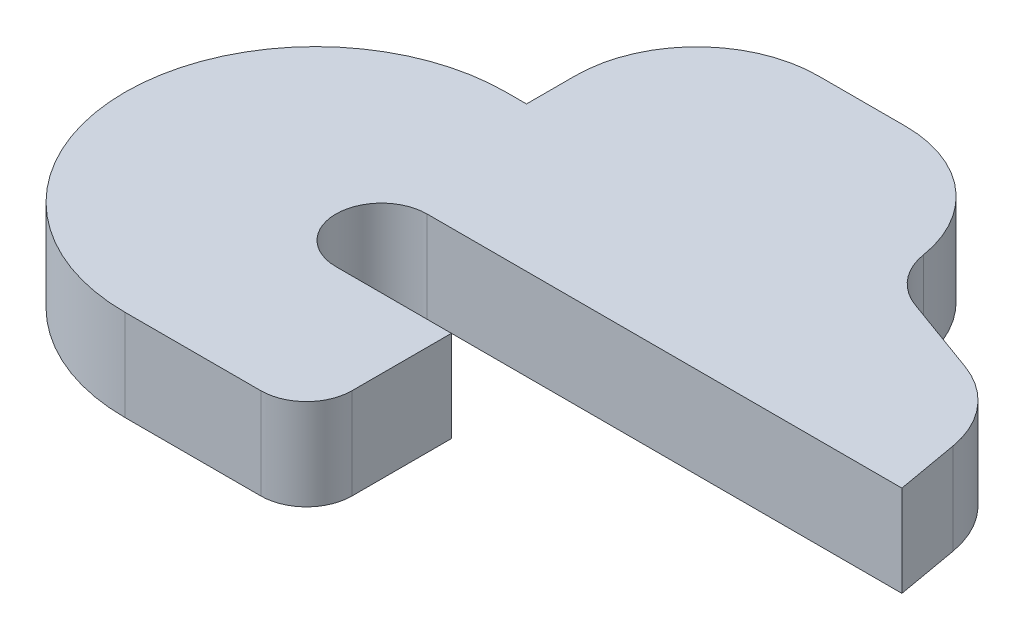
ISO-10303-21;
HEADER;
FILE_DESCRIPTION(('STEP AP214'),'2;1');
FILE_NAME('part.step','',(''),(''),'','','');
FILE_SCHEMA(('AUTOMOTIVE_DESIGN { 1 0 10303 214 1 1 1 1 }'));
ENDSEC;
DATA;
#1=APPLICATION_CONTEXT('core data for automotive mechanical design processes');
#2=APPLICATION_PROTOCOL_DEFINITION('international standard','automotive_design',2000,#1);
#3=PRODUCT_CONTEXT('',#1,'mechanical');
#4=PRODUCT('Part','Part','',(#3));
#5=PRODUCT_RELATED_PRODUCT_CATEGORY('part','',(#4));
#6=PRODUCT_DEFINITION_FORMATION('','',#4);
#7=PRODUCT_DEFINITION_CONTEXT('part definition',#1,'design');
#8=PRODUCT_DEFINITION('design','',#6,#7);
#9=PRODUCT_DEFINITION_SHAPE('','',#8);
#10=(LENGTH_UNIT() NAMED_UNIT(*) SI_UNIT(.MILLI.,.METRE.));
#11=(NAMED_UNIT(*) PLANE_ANGLE_UNIT() SI_UNIT($,.RADIAN.));
#12=(NAMED_UNIT(*) SI_UNIT($,.STERADIAN.) SOLID_ANGLE_UNIT());
#13=UNCERTAINTY_MEASURE_WITH_UNIT(LENGTH_MEASURE(1.E-05),#10,'distance_accuracy_value','');
#14=(GEOMETRIC_REPRESENTATION_CONTEXT(3) GLOBAL_UNCERTAINTY_ASSIGNED_CONTEXT((#13)) GLOBAL_UNIT_ASSIGNED_CONTEXT((#10,
#11,#12)) REPRESENTATION_CONTEXT('',''));
#15=CARTESIAN_POINT('',(0.,0.,0.));
#16=DIRECTION('',(0.,0.,1.));
#17=DIRECTION('',(1.,0.,0.));
#18=AXIS2_PLACEMENT_3D('',#15,#16,#17);
#19=CARTESIAN_POINT('',(0.,3.,3.27));
#20=DIRECTION('',(-1.,0.,0.));
#21=DIRECTION('',(0.,0.,1.));
#22=AXIS2_PLACEMENT_3D('',#19,#20,#21);
#23=PLANE('',#22);
#24=DIRECTION('',(0.,0.,-1.));
#25=VECTOR('',#24,1.);
#26=CARTESIAN_POINT('',(0.,0.,3.27));
#27=LINE('',#26,#25);
#28=CARTESIAN_POINT('',(0.,0.,3.27));
#29=VERTEX_POINT('',#28);
#30=CARTESIAN_POINT('',(0.,0.,0.));
#31=VERTEX_POINT('',#30);
#32=EDGE_CURVE('E177',#29,#31,#27,.T.);
#33=ORIENTED_EDGE('',*,*,#32,.T.);
#34=DIRECTION('',(0.,-1.,0.));
#35=VECTOR('',#34,1.);
#36=CARTESIAN_POINT('',(0.,3.,0.));
#37=LINE('',#36,#35);
#38=CARTESIAN_POINT('',(0.,3.,0.));
#39=VERTEX_POINT('',#38);
#40=EDGE_CURVE('E11',#39,#31,#37,.T.);
#41=ORIENTED_EDGE('',*,*,#40,.F.);
#42=DIRECTION('',(0.,0.,-1.));
#43=VECTOR('',#42,1.);
#44=CARTESIAN_POINT('',(0.,3.,3.27));
#45=LINE('',#44,#43);
#46=CARTESIAN_POINT('',(0.,3.,3.27));
#47=VERTEX_POINT('',#46);
#48=EDGE_CURVE('E207',#47,#39,#45,.T.);
#49=ORIENTED_EDGE('',*,*,#48,.F.);
#50=DIRECTION('',(0.,-1.,0.));
#51=VECTOR('',#50,1.);
#52=CARTESIAN_POINT('',(0.,3.,3.27));
#53=LINE('',#52,#51);
#54=EDGE_CURVE('E173',#47,#29,#53,.T.);
#55=ORIENTED_EDGE('',*,*,#54,.T.);
#56=EDGE_LOOP('',(#33,#41,#49,#55));
#57=FACE_BOUND('',#56,.T.);
#58=ADVANCED_FACE('F33',(#57),#23,.F.);
#59=CARTESIAN_POINT('',(0.,3.,0.));
#60=DIRECTION('',(0.,0.,1.));
#61=DIRECTION('',(1.,0.,0.));
#62=AXIS2_PLACEMENT_3D('',#59,#60,#61);
#63=PLANE('',#62);
#64=DIRECTION('',(-1.,0.,0.));
#65=VECTOR('',#64,1.);
#66=CARTESIAN_POINT('',(0.,0.,0.));
#67=LINE('',#66,#65);
#68=CARTESIAN_POINT('',(-3.8,0.,0.));
#69=VERTEX_POINT('',#68);
#70=EDGE_CURVE('E180',#31,#69,#67,.T.);
#71=ORIENTED_EDGE('',*,*,#70,.T.);
#72=DIRECTION('',(0.,-1.,0.));
#73=VECTOR('',#72,1.);
#74=CARTESIAN_POINT('',(-3.8,3.,0.));
#75=LINE('',#74,#73);
#76=CARTESIAN_POINT('',(-3.8,3.,0.));
#77=VERTEX_POINT('',#76);
#78=EDGE_CURVE('E41',#77,#69,#75,.T.);
#79=ORIENTED_EDGE('',*,*,#78,.F.);
#80=DIRECTION('',(-1.,0.,0.));
#81=VECTOR('',#80,1.);
#82=CARTESIAN_POINT('',(0.,3.,0.));
#83=LINE('',#82,#81);
#84=EDGE_CURVE('E116',#39,#77,#83,.T.);
#85=ORIENTED_EDGE('',*,*,#84,.F.);
#86=ORIENTED_EDGE('',*,*,#40,.T.);
#87=EDGE_LOOP('',(#71,#79,#85,#86));
#88=FACE_BOUND('',#87,.T.);
#89=ADVANCED_FACE('F305',(#88),#63,.F.);
#90=CARTESIAN_POINT('',(-3.8,3.,-1.5));
#91=DIRECTION('',(0.,-1.,0.));
#92=DIRECTION('',(0.,0.,-1.));
#93=AXIS2_PLACEMENT_3D('',#90,#91,#92);
#94=CYLINDRICAL_SURFACE('',#93,1.5);
#95=CARTESIAN_POINT('',(-3.8,0.,-1.5));
#96=DIRECTION('',(0.,-1.,0.));
#97=DIRECTION('',(0.,0.,-1.));
#98=AXIS2_PLACEMENT_3D('',#95,#96,#97);
#99=CIRCLE('',#98,1.5);
#100=CARTESIAN_POINT('',(-3.8,0.,-3.));
#101=VERTEX_POINT('',#100);
#102=EDGE_CURVE('E182',#69,#101,#99,.T.);
#103=ORIENTED_EDGE('',*,*,#102,.T.);
#104=DIRECTION('',(0.,-1.,0.));
#105=VECTOR('',#104,1.);
#106=CARTESIAN_POINT('',(-3.8,3.,-3.));
#107=LINE('',#106,#105);
#108=CARTESIAN_POINT('',(-3.8,3.,-3.));
#109=VERTEX_POINT('',#108);
#110=EDGE_CURVE('E238',#109,#101,#107,.T.);
#111=ORIENTED_EDGE('',*,*,#110,.F.);
#112=CARTESIAN_POINT('',(-3.8,3.,-1.5));
#113=DIRECTION('',(0.,-1.,0.));
#114=DIRECTION('',(0.,0.,-1.));
#115=AXIS2_PLACEMENT_3D('',#112,#113,#114);
#116=CIRCLE('',#115,1.5);
#117=EDGE_CURVE('E246',#77,#109,#116,.T.);
#118=ORIENTED_EDGE('',*,*,#117,.F.);
#119=ORIENTED_EDGE('',*,*,#78,.T.);
#120=EDGE_LOOP('',(#103,#111,#118,#119));
#121=FACE_BOUND('',#120,.T.);
#122=ADVANCED_FACE('F244',(#121),#94,.F.);
#123=CARTESIAN_POINT('',(-3.8,3.,-3.));
#124=DIRECTION('',(0.,0.,-1.));
#125=DIRECTION('',(-1.,0.,0.));
#126=AXIS2_PLACEMENT_3D('',#123,#124,#125);
#127=PLANE('',#126);
#128=DIRECTION('',(1.,0.,0.));
#129=VECTOR('',#128,1.);
#130=CARTESIAN_POINT('',(-3.8,0.,-3.));
#131=LINE('',#130,#129);
#132=CARTESIAN_POINT('',(11.82,0.,-3.));
#133=VERTEX_POINT('',#132);
#134=EDGE_CURVE('E184',#101,#133,#131,.T.);
#135=ORIENTED_EDGE('',*,*,#134,.T.);
#136=DIRECTION('',(0.,-1.,0.));
#137=VECTOR('',#136,1.);
#138=CARTESIAN_POINT('',(11.82,3.,-3.));
#139=LINE('',#138,#137);
#140=CARTESIAN_POINT('',(11.82,3.,-3.));
#141=VERTEX_POINT('',#140);
#142=EDGE_CURVE('E235',#141,#133,#139,.T.);
#143=ORIENTED_EDGE('',*,*,#142,.F.);
#144=DIRECTION('',(1.,0.,0.));
#145=VECTOR('',#144,1.);
#146=CARTESIAN_POINT('',(-3.8,3.,-3.));
#147=LINE('',#146,#145);
#148=EDGE_CURVE('E264',#109,#141,#147,.T.);
#149=ORIENTED_EDGE('',*,*,#148,.F.);
#150=ORIENTED_EDGE('',*,*,#110,.T.);
#151=EDGE_LOOP('',(#135,#143,#149,#150));
#152=FACE_BOUND('',#151,.T.);
#153=ADVANCED_FACE('F255',(#152),#127,.F.);
#154=CARTESIAN_POINT('',(11.82,3.,-3.));
#155=DIRECTION('',(-0.984807753012207,0.,0.173648177666935));
#156=DIRECTION('',(0.173648177666935,0.,0.984807753012207));
#157=AXIS2_PLACEMENT_3D('',#154,#155,#156);
#158=PLANE('',#157);
#159=DIRECTION('',(-0.173648177666935,0.,-0.984807753012207));
#160=VECTOR('',#159,1.);
#161=CARTESIAN_POINT('',(11.82,0.,-3.));
#162=LINE('',#161,#160);
#163=CARTESIAN_POINT('',(11.4588221154867,0.,-5.04834157008812));
#164=VERTEX_POINT('',#163);
#165=EDGE_CURVE('E186',#133,#164,#162,.T.);
#166=ORIENTED_EDGE('',*,*,#165,.T.);
#167=DIRECTION('',(0.,-1.,0.));
#168=VECTOR('',#167,1.);
#169=CARTESIAN_POINT('',(11.4588221154867,3.,-5.04834157008812));
#170=LINE('',#169,#168);
#171=CARTESIAN_POINT('',(11.4588221154867,3.,-5.04834157008812));
#172=VERTEX_POINT('',#171);
#173=EDGE_CURVE('E232',#172,#164,#170,.T.);
#174=ORIENTED_EDGE('',*,*,#173,.F.);
#175=DIRECTION('',(-0.173648177666935,0.,-0.984807753012207));
#176=VECTOR('',#175,1.);
#177=CARTESIAN_POINT('',(11.82,3.,-3.));
#178=LINE('',#177,#176);
#179=EDGE_CURVE('E261',#141,#172,#178,.T.);
#180=ORIENTED_EDGE('',*,*,#179,.F.);
#181=ORIENTED_EDGE('',*,*,#142,.T.);
#182=EDGE_LOOP('',(#166,#174,#180,#181));
#183=FACE_BOUND('',#182,.T.);
#184=ADVANCED_FACE('F259',(#183),#158,.F.);
#185=CARTESIAN_POINT('',(8.30743730584765,3.,-4.49266740155393));
#186=DIRECTION('',(0.,-1.,0.));
#187=DIRECTION('',(0.,0.,-1.));
#188=AXIS2_PLACEMENT_3D('',#185,#186,#187);
#189=CYLINDRICAL_SURFACE('',#188,3.2);
#190=CARTESIAN_POINT('',(8.30743730584765,0.,-4.49266740155393));
#191=DIRECTION('',(0.,1.,0.));
#192=DIRECTION('',(0.,0.,1.));
#193=AXIS2_PLACEMENT_3D('',#190,#191,#192);
#194=CIRCLE('',#193,3.2);
#195=CARTESIAN_POINT('',(9.40103258853848,0.,-7.5));
#196=VERTEX_POINT('',#195);
#197=EDGE_CURVE('E188',#164,#196,#194,.T.);
#198=ORIENTED_EDGE('',*,*,#197,.T.);
#199=DIRECTION('',(0.,-1.,0.));
#200=VECTOR('',#199,1.);
#201=CARTESIAN_POINT('',(9.40103258853848,3.,-7.5));
#202=LINE('',#201,#200);
#203=CARTESIAN_POINT('',(9.40103258853848,3.,-7.5));
#204=VERTEX_POINT('',#203);
#205=EDGE_CURVE('E229',#204,#196,#202,.T.);
#206=ORIENTED_EDGE('',*,*,#205,.F.);
#207=CARTESIAN_POINT('',(8.30743730584765,3.,-4.49266740155393));
#208=DIRECTION('',(0.,1.,0.));
#209=DIRECTION('',(0.,0.,1.));
#210=AXIS2_PLACEMENT_3D('',#207,#208,#209);
#211=CIRCLE('',#210,3.2);
#212=EDGE_CURVE('E263',#172,#204,#211,.T.);
#213=ORIENTED_EDGE('',*,*,#212,.F.);
#214=ORIENTED_EDGE('',*,*,#173,.T.);
#215=EDGE_LOOP('',(#198,#206,#213,#214));
#216=FACE_BOUND('',#215,.T.);
#217=ADVANCED_FACE('F318',(#216),#189,.T.);
#218=CARTESIAN_POINT('',(6.82,3.,-8.43857429163487));
#219=DIRECTION('',(-0.341748525840883,0.,0.939791437014396));
#220=DIRECTION('',(0.939791437014396,0.,0.341748525840883));
#221=AXIS2_PLACEMENT_3D('',#218,#219,#220);
#222=PLANE('',#221);
#223=DIRECTION('',(-0.939791437014396,0.,-0.341748525840883));
#224=VECTOR('',#223,1.);
#225=CARTESIAN_POINT('',(6.82,0.,-8.43857429163487));
#226=LINE('',#225,#224);
#227=CARTESIAN_POINT('',(6.82,0.,-8.43857429163487));
#228=VERTEX_POINT('',#227);
#229=EDGE_CURVE('E190',#196,#228,#226,.T.);
#230=ORIENTED_EDGE('',*,*,#229,.T.);
#231=DIRECTION('',(0.,-1.,0.));
#232=VECTOR('',#231,1.);
#233=CARTESIAN_POINT('',(6.82,3.,-8.43857429163487));
#234=LINE('',#233,#232);
#235=CARTESIAN_POINT('',(6.82,3.,-8.43857429163487));
#236=VERTEX_POINT('',#235);
#237=EDGE_CURVE('E226',#236,#228,#234,.T.);
#238=ORIENTED_EDGE('',*,*,#237,.F.);
#239=DIRECTION('',(-0.939791437014396,0.,-0.341748525840883));
#240=VECTOR('',#239,1.);
#241=CARTESIAN_POINT('',(6.82,3.,-8.43857429163487));
#242=LINE('',#241,#240);
#243=EDGE_CURVE('E266',#204,#236,#242,.T.);
#244=ORIENTED_EDGE('',*,*,#243,.F.);
#245=ORIENTED_EDGE('',*,*,#205,.T.);
#246=EDGE_LOOP('',(#230,#238,#244,#245));
#247=FACE_BOUND('',#246,.T.);
#248=ADVANCED_FACE('F321',(#247),#222,.F.);
#249=CARTESIAN_POINT('',(7.50349705168176,3.,-10.3181571656637));
#250=DIRECTION('',(0.,-1.,0.));
#251=DIRECTION('',(0.,0.,-1.));
#252=AXIS2_PLACEMENT_3D('',#249,#250,#251);
#253=CYLINDRICAL_SURFACE('',#252,2.);
#254=CARTESIAN_POINT('',(7.50349705168176,0.,-10.3181571656637));
#255=DIRECTION('',(0.,-1.,0.));
#256=DIRECTION('',(0.,0.,-1.));
#257=AXIS2_PLACEMENT_3D('',#254,#255,#256);
#258=CIRCLE('',#257,2.);
#259=CARTESIAN_POINT('',(5.52862721098619,0.,-10.0021047771091));
#260=VERTEX_POINT('',#259);
#261=EDGE_CURVE('E192',#228,#260,#258,.T.);
#262=ORIENTED_EDGE('',*,*,#261,.T.);
#263=DIRECTION('',(0.,-1.,0.));
#264=VECTOR('',#263,1.);
#265=CARTESIAN_POINT('',(5.52862721098619,3.,-10.0021047771091));
#266=LINE('',#265,#264);
#267=CARTESIAN_POINT('',(5.52862721098619,3.,-10.0021047771091));
#268=VERTEX_POINT('',#267);
#269=EDGE_CURVE('E223',#268,#260,#266,.T.);
#270=ORIENTED_EDGE('',*,*,#269,.F.);
#271=CARTESIAN_POINT('',(7.50349705168176,3.,-10.3181571656637));
#272=DIRECTION('',(0.,-1.,0.));
#273=DIRECTION('',(0.,0.,-1.));
#274=AXIS2_PLACEMENT_3D('',#271,#272,#273);
#275=CIRCLE('',#274,2.);
#276=EDGE_CURVE('E272',#236,#268,#275,.T.);
#277=ORIENTED_EDGE('',*,*,#276,.F.);
#278=ORIENTED_EDGE('',*,*,#237,.T.);
#279=EDGE_LOOP('',(#262,#270,#277,#278));
#280=FACE_BOUND('',#279,.T.);
#281=ADVANCED_FACE('F325',(#280),#253,.F.);
#282=CARTESIAN_POINT('',(1.57888752959504,3.,-9.37));
#283=DIRECTION('',(0.,-1.,0.));
#284=DIRECTION('',(0.,0.,-1.));
#285=AXIS2_PLACEMENT_3D('',#282,#283,#284);
#286=CYLINDRICAL_SURFACE('',#285,4.);
#287=CARTESIAN_POINT('',(1.57888752959504,0.,-9.37));
#288=DIRECTION('',(0.,1.,0.));
#289=DIRECTION('',(0.,0.,-1.));
#290=AXIS2_PLACEMENT_3D('',#287,#288,#289);
#291=CIRCLE('',#290,4.);
#292=CARTESIAN_POINT('',(1.57888752959504,0.,-13.37));
#293=VERTEX_POINT('',#292);
#294=EDGE_CURVE('E194',#260,#293,#291,.T.);
#295=ORIENTED_EDGE('',*,*,#294,.T.);
#296=DIRECTION('',(0.,-1.,0.));
#297=VECTOR('',#296,1.);
#298=CARTESIAN_POINT('',(1.57888752959504,3.,-13.37));
#299=LINE('',#298,#297);
#300=CARTESIAN_POINT('',(1.57888752959504,3.,-13.37));
#301=VERTEX_POINT('',#300);
#302=EDGE_CURVE('E220',#301,#293,#299,.T.);
#303=ORIENTED_EDGE('',*,*,#302,.F.);
#304=CARTESIAN_POINT('',(1.57888752959504,3.,-9.37));
#305=DIRECTION('',(0.,1.,0.));
#306=DIRECTION('',(0.,0.,-1.));
#307=AXIS2_PLACEMENT_3D('',#304,#305,#306);
#308=CIRCLE('',#307,4.);
#309=EDGE_CURVE('E274',#268,#301,#308,.T.);
#310=ORIENTED_EDGE('',*,*,#309,.F.);
#311=ORIENTED_EDGE('',*,*,#269,.T.);
#312=EDGE_LOOP('',(#295,#303,#310,#311));
#313=FACE_BOUND('',#312,.T.);
#314=ADVANCED_FACE('F329',(#313),#286,.T.);
#315=CARTESIAN_POINT('',(1.57888752959504,3.,-13.37));
#316=DIRECTION('',(0.,0.,1.));
#317=DIRECTION('',(1.,0.,0.));
#318=AXIS2_PLACEMENT_3D('',#315,#316,#317);
#319=PLANE('',#318);
#320=DIRECTION('',(-1.,0.,0.));
#321=VECTOR('',#320,1.);
#322=CARTESIAN_POINT('',(1.57888752959504,0.,-13.37));
#323=LINE('',#322,#321);
#324=CARTESIAN_POINT('',(-1.3,0.,-13.37));
#325=VERTEX_POINT('',#324);
#326=EDGE_CURVE('E196',#293,#325,#323,.T.);
#327=ORIENTED_EDGE('',*,*,#326,.T.);
#328=DIRECTION('',(0.,-1.,0.));
#329=VECTOR('',#328,1.);
#330=CARTESIAN_POINT('',(-1.3,3.,-13.37));
#331=LINE('',#330,#329);
#332=CARTESIAN_POINT('',(-1.3,3.,-13.37));
#333=VERTEX_POINT('',#332);
#334=EDGE_CURVE('E217',#333,#325,#331,.T.);
#335=ORIENTED_EDGE('',*,*,#334,.F.);
#336=DIRECTION('',(-1.,0.,0.));
#337=VECTOR('',#336,1.);
#338=CARTESIAN_POINT('',(1.57888752959504,3.,-13.37));
#339=LINE('',#338,#337);
#340=EDGE_CURVE('E276',#301,#333,#339,.T.);
#341=ORIENTED_EDGE('',*,*,#340,.F.);
#342=ORIENTED_EDGE('',*,*,#302,.T.);
#343=EDGE_LOOP('',(#327,#335,#341,#342));
#344=FACE_BOUND('',#343,.T.);
#345=ADVANCED_FACE('F333',(#344),#319,.F.);
#346=CARTESIAN_POINT('',(-1.3,3.,-9.37));
#347=DIRECTION('',(0.,-1.,0.));
#348=DIRECTION('',(0.,0.,-1.));
#349=AXIS2_PLACEMENT_3D('',#346,#347,#348);
#350=CYLINDRICAL_SURFACE('',#349,4.);
#351=CARTESIAN_POINT('',(-1.3,0.,-9.37));
#352=DIRECTION('',(0.,1.,0.));
#353=DIRECTION('',(0.,0.,1.));
#354=AXIS2_PLACEMENT_3D('',#351,#352,#353);
#355=CIRCLE('',#354,4.);
#356=CARTESIAN_POINT('',(-5.3,0.,-9.37));
#357=VERTEX_POINT('',#356);
#358=EDGE_CURVE('E198',#325,#357,#355,.T.);
#359=ORIENTED_EDGE('',*,*,#358,.T.);
#360=DIRECTION('',(0.,-1.,0.));
#361=VECTOR('',#360,1.);
#362=CARTESIAN_POINT('',(-5.3,3.,-9.37));
#363=LINE('',#362,#361);
#364=CARTESIAN_POINT('',(-5.3,3.,-9.37));
#365=VERTEX_POINT('',#364);
#366=EDGE_CURVE('E214',#365,#357,#363,.T.);
#367=ORIENTED_EDGE('',*,*,#366,.F.);
#368=CARTESIAN_POINT('',(-1.3,3.,-9.37));
#369=DIRECTION('',(0.,1.,0.));
#370=DIRECTION('',(0.,0.,1.));
#371=AXIS2_PLACEMENT_3D('',#368,#369,#370);
#372=CIRCLE('',#371,4.);
#373=EDGE_CURVE('E278',#333,#365,#372,.T.);
#374=ORIENTED_EDGE('',*,*,#373,.F.);
#375=ORIENTED_EDGE('',*,*,#334,.T.);
#376=EDGE_LOOP('',(#359,#367,#374,#375));
#377=FACE_BOUND('',#376,.T.);
#378=ADVANCED_FACE('F337',(#377),#350,.T.);
#379=CARTESIAN_POINT('',(-5.3,3.,-9.37));
#380=DIRECTION('',(1.,0.,0.));
#381=DIRECTION('',(0.,0.,-1.));
#382=AXIS2_PLACEMENT_3D('',#379,#380,#381);
#383=PLANE('',#382);
#384=DIRECTION('',(0.,0.,1.));
#385=VECTOR('',#384,1.);
#386=CARTESIAN_POINT('',(-5.3,0.,-9.37));
#387=LINE('',#386,#385);
#388=CARTESIAN_POINT('',(-5.3,0.,-7.77));
#389=VERTEX_POINT('',#388);
#390=EDGE_CURVE('E200',#357,#389,#387,.T.);
#391=ORIENTED_EDGE('',*,*,#390,.T.);
#392=DIRECTION('',(0.,-1.,0.));
#393=VECTOR('',#392,1.);
#394=CARTESIAN_POINT('',(-5.3,3.,-7.77));
#395=LINE('',#394,#393);
#396=CARTESIAN_POINT('',(-5.3,3.,-7.77));
#397=VERTEX_POINT('',#396);
#398=EDGE_CURVE('E211',#397,#389,#395,.T.);
#399=ORIENTED_EDGE('',*,*,#398,.F.);
#400=DIRECTION('',(0.,0.,1.));
#401=VECTOR('',#400,1.);
#402=CARTESIAN_POINT('',(-5.3,3.,-9.37));
#403=LINE('',#402,#401);
#404=EDGE_CURVE('E280',#365,#397,#403,.T.);
#405=ORIENTED_EDGE('',*,*,#404,.F.);
#406=ORIENTED_EDGE('',*,*,#366,.T.);
#407=EDGE_LOOP('',(#391,#399,#405,#406));
#408=FACE_BOUND('',#407,.T.);
#409=ADVANCED_FACE('F286',(#408),#383,.F.);
#410=CARTESIAN_POINT('',(-5.3,3.,-7.77));
#411=DIRECTION('',(0.,0.,1.));
#412=DIRECTION('',(1.,0.,0.));
#413=AXIS2_PLACEMENT_3D('',#410,#411,#412);
#414=PLANE('',#413);
#415=DIRECTION('',(-1.,0.,0.));
#416=VECTOR('',#415,1.);
#417=CARTESIAN_POINT('',(-5.3,0.,-7.77));
#418=LINE('',#417,#416);
#419=CARTESIAN_POINT('',(-5.97,0.,-7.77));
#420=VERTEX_POINT('',#419);
#421=EDGE_CURVE('E202',#389,#420,#418,.T.);
#422=ORIENTED_EDGE('',*,*,#421,.T.);
#423=DIRECTION('',(0.,-1.,0.));
#424=VECTOR('',#423,1.);
#425=CARTESIAN_POINT('',(-5.97,3.,-7.77));
#426=LINE('',#425,#424);
#427=CARTESIAN_POINT('',(-5.97,3.,-7.77));
#428=VERTEX_POINT('',#427);
#429=EDGE_CURVE('E168',#428,#420,#426,.T.);
#430=ORIENTED_EDGE('',*,*,#429,.F.);
#431=DIRECTION('',(-1.,0.,0.));
#432=VECTOR('',#431,1.);
#433=CARTESIAN_POINT('',(-5.3,3.,-7.77));
#434=LINE('',#433,#432);
#435=EDGE_CURVE('E159',#397,#428,#434,.T.);
#436=ORIENTED_EDGE('',*,*,#435,.F.);
#437=ORIENTED_EDGE('',*,*,#398,.T.);
#438=EDGE_LOOP('',(#422,#430,#436,#437));
#439=FACE_BOUND('',#438,.T.);
#440=ADVANCED_FACE('F290',(#439),#414,.F.);
#441=CARTESIAN_POINT('',(-5.97,3.,-1.5));
#442=DIRECTION('',(0.,-1.,0.));
#443=DIRECTION('',(0.,0.,-1.));
#444=AXIS2_PLACEMENT_3D('',#441,#442,#443);
#445=CYLINDRICAL_SURFACE('',#444,6.27);
#446=CARTESIAN_POINT('',(-5.97,0.,-1.5));
#447=DIRECTION('',(0.,1.,0.));
#448=DIRECTION('',(0.,0.,1.));
#449=AXIS2_PLACEMENT_3D('',#446,#447,#448);
#450=CIRCLE('',#449,6.27);
#451=CARTESIAN_POINT('',(-5.97,0.,4.77));
#452=VERTEX_POINT('',#451);
#453=EDGE_CURVE('E167',#420,#452,#450,.T.);
#454=ORIENTED_EDGE('',*,*,#453,.T.);
#455=DIRECTION('',(0.,-1.,0.));
#456=VECTOR('',#455,1.);
#457=CARTESIAN_POINT('',(-5.97,3.,4.77));
#458=LINE('',#457,#456);
#459=CARTESIAN_POINT('',(-5.97,3.,4.77));
#460=VERTEX_POINT('',#459);
#461=EDGE_CURVE('E164',#460,#452,#458,.T.);
#462=ORIENTED_EDGE('',*,*,#461,.F.);
#463=CARTESIAN_POINT('',(-5.97,3.,-1.5));
#464=DIRECTION('',(0.,1.,0.));
#465=DIRECTION('',(0.,0.,1.));
#466=AXIS2_PLACEMENT_3D('',#463,#464,#465);
#467=CIRCLE('',#466,6.27);
#468=EDGE_CURVE('E153',#428,#460,#467,.T.);
#469=ORIENTED_EDGE('',*,*,#468,.F.);
#470=ORIENTED_EDGE('',*,*,#429,.T.);
#471=EDGE_LOOP('',(#454,#462,#469,#470));
#472=FACE_BOUND('',#471,.T.);
#473=ADVANCED_FACE('F165',(#472),#445,.T.);
#474=CARTESIAN_POINT('',(-5.97,3.,4.77));
#475=DIRECTION('',(0.,0.,-1.));
#476=DIRECTION('',(-1.,0.,0.));
#477=AXIS2_PLACEMENT_3D('',#474,#475,#476);
#478=PLANE('',#477);
#479=DIRECTION('',(1.,0.,0.));
#480=VECTOR('',#479,1.);
#481=CARTESIAN_POINT('',(-5.97,0.,4.77));
#482=LINE('',#481,#480);
#483=CARTESIAN_POINT('',(-1.5,0.,4.77));
#484=VERTEX_POINT('',#483);
#485=EDGE_CURVE('E102',#452,#484,#482,.T.);
#486=ORIENTED_EDGE('',*,*,#485,.T.);
#487=DIRECTION('',(0.,-1.,0.));
#488=VECTOR('',#487,1.);
#489=CARTESIAN_POINT('',(-1.5,3.,4.77));
#490=LINE('',#489,#488);
#491=CARTESIAN_POINT('',(-1.5,3.,4.77));
#492=VERTEX_POINT('',#491);
#493=EDGE_CURVE('E169',#492,#484,#490,.T.);
#494=ORIENTED_EDGE('',*,*,#493,.F.);
#495=DIRECTION('',(1.,0.,0.));
#496=VECTOR('',#495,1.);
#497=CARTESIAN_POINT('',(-5.97,3.,4.77));
#498=LINE('',#497,#496);
#499=EDGE_CURVE('E157',#460,#492,#498,.T.);
#500=ORIENTED_EDGE('',*,*,#499,.F.);
#501=ORIENTED_EDGE('',*,*,#461,.T.);
#502=EDGE_LOOP('',(#486,#494,#500,#501));
#503=FACE_BOUND('',#502,.T.);
#504=ADVANCED_FACE('F171',(#503),#478,.F.);
#505=CARTESIAN_POINT('',(-1.5,3.,3.27));
#506=DIRECTION('',(0.,-1.,0.));
#507=DIRECTION('',(0.,0.,-1.));
#508=AXIS2_PLACEMENT_3D('',#505,#506,#507);
#509=CYLINDRICAL_SURFACE('',#508,1.5);
#510=CARTESIAN_POINT('',(-1.5,0.,3.27));
#511=DIRECTION('',(0.,1.,0.));
#512=DIRECTION('',(0.,0.,1.));
#513=AXIS2_PLACEMENT_3D('',#510,#511,#512);
#514=CIRCLE('',#513,1.5);
#515=EDGE_CURVE('E108',#484,#29,#514,.T.);
#516=ORIENTED_EDGE('',*,*,#515,.T.);
#517=ORIENTED_EDGE('',*,*,#54,.F.);
#518=CARTESIAN_POINT('',(-1.5,3.,3.27));
#519=DIRECTION('',(0.,1.,0.));
#520=DIRECTION('',(0.,0.,1.));
#521=AXIS2_PLACEMENT_3D('',#518,#519,#520);
#522=CIRCLE('',#521,1.5);
#523=EDGE_CURVE('E49',#492,#47,#522,.T.);
#524=ORIENTED_EDGE('',*,*,#523,.F.);
#525=ORIENTED_EDGE('',*,*,#493,.T.);
#526=EDGE_LOOP('',(#516,#517,#524,#525));
#527=FACE_BOUND('',#526,.T.);
#528=ADVANCED_FACE('F294',(#527),#509,.T.);
#529=CARTESIAN_POINT('',(-3.8,3.,-1.5));
#530=DIRECTION('',(0.,-1.,0.));
#531=DIRECTION('',(0.,0.,-1.));
#532=AXIS2_PLACEMENT_3D('',#529,#530,#531);
#533=PLANE('',#532);
#534=ORIENTED_EDGE('',*,*,#48,.T.);
#535=ORIENTED_EDGE('',*,*,#84,.T.);
#536=ORIENTED_EDGE('',*,*,#117,.T.);
#537=ORIENTED_EDGE('',*,*,#148,.T.);
#538=ORIENTED_EDGE('',*,*,#179,.T.);
#539=ORIENTED_EDGE('',*,*,#212,.T.);
#540=ORIENTED_EDGE('',*,*,#243,.T.);
#541=ORIENTED_EDGE('',*,*,#276,.T.);
#542=ORIENTED_EDGE('',*,*,#309,.T.);
#543=ORIENTED_EDGE('',*,*,#340,.T.);
#544=ORIENTED_EDGE('',*,*,#373,.T.);
#545=ORIENTED_EDGE('',*,*,#404,.T.);
#546=ORIENTED_EDGE('',*,*,#435,.T.);
#547=ORIENTED_EDGE('',*,*,#468,.T.);
#548=ORIENTED_EDGE('',*,*,#499,.T.);
#549=ORIENTED_EDGE('',*,*,#523,.T.);
#550=EDGE_LOOP('',(#534,#535,#536,#537,#538,#539,#540,#541,#542,#543,#544,#545,#546,#547,#548,#549));
#551=FACE_BOUND('',#550,.T.);
#552=ADVANCED_FACE('F155',(#551),#533,.F.);
#553=CARTESIAN_POINT('',(-3.8,0.,-1.5));
#554=DIRECTION('',(0.,-1.,0.));
#555=DIRECTION('',(0.,0.,-1.));
#556=AXIS2_PLACEMENT_3D('',#553,#554,#555);
#557=PLANE('',#556);
#558=ORIENTED_EDGE('',*,*,#32,.F.);
#559=ORIENTED_EDGE('',*,*,#515,.F.);
#560=ORIENTED_EDGE('',*,*,#485,.F.);
#561=ORIENTED_EDGE('',*,*,#453,.F.);
#562=ORIENTED_EDGE('',*,*,#421,.F.);
#563=ORIENTED_EDGE('',*,*,#390,.F.);
#564=ORIENTED_EDGE('',*,*,#358,.F.);
#565=ORIENTED_EDGE('',*,*,#326,.F.);
#566=ORIENTED_EDGE('',*,*,#294,.F.);
#567=ORIENTED_EDGE('',*,*,#261,.F.);
#568=ORIENTED_EDGE('',*,*,#229,.F.);
#569=ORIENTED_EDGE('',*,*,#197,.F.);
#570=ORIENTED_EDGE('',*,*,#165,.F.);
#571=ORIENTED_EDGE('',*,*,#134,.F.);
#572=ORIENTED_EDGE('',*,*,#102,.F.);
#573=ORIENTED_EDGE('',*,*,#70,.F.);
#574=EDGE_LOOP('',(#558,#559,#560,#561,#562,#563,#564,#565,#566,#567,#568,#569,#570,#571,#572,#573));
#575=FACE_BOUND('',#574,.T.);
#576=ADVANCED_FACE('F250',(#575),#557,.T.);
#577=CLOSED_SHELL('',(#58,#89,#122,#153,#184,#217,#248,#281,#314,#345,#378,#409,#440,#473,#504,
#528,#552,#576));
#578=MANIFOLD_SOLID_BREP('B2',#577);
#579=ADVANCED_BREP_SHAPE_REPRESENTATION('',(#18,#578),#14);
#580=SHAPE_DEFINITION_REPRESENTATION(#9,#579);
ENDSEC;
END-ISO-10303-21;
